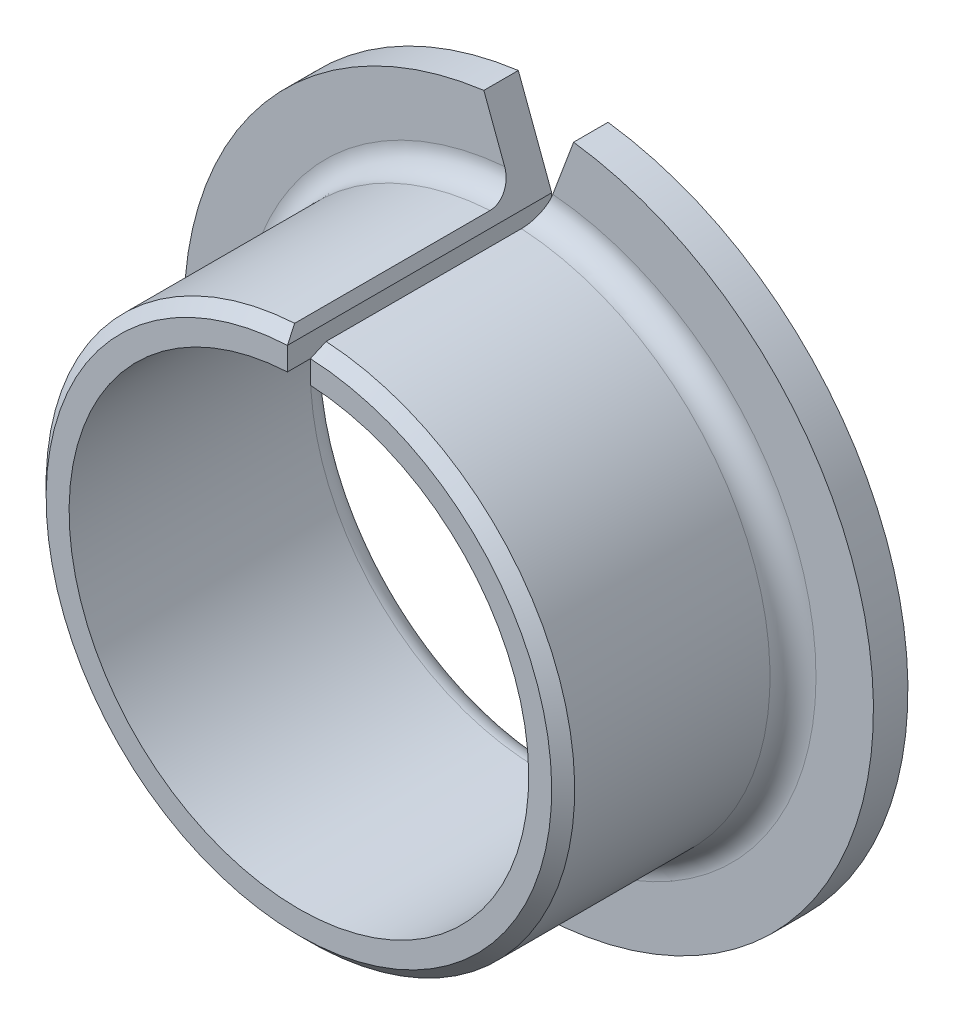
ISO-10303-21;
HEADER;
FILE_DESCRIPTION(('STEP AP214'),'2;1');
FILE_NAME('part.step','',(''),(''),'','','');
FILE_SCHEMA(('AUTOMOTIVE_DESIGN { 1 0 10303 214 1 1 1 1 }'));
ENDSEC;
DATA;
#1=APPLICATION_CONTEXT('core data for automotive mechanical design processes');
#2=APPLICATION_PROTOCOL_DEFINITION('international standard','automotive_design',2000,#1);
#3=PRODUCT_CONTEXT('',#1,'mechanical');
#4=PRODUCT('Part','Part','',(#3));
#5=PRODUCT_RELATED_PRODUCT_CATEGORY('part','',(#4));
#6=PRODUCT_DEFINITION_FORMATION('','',#4);
#7=PRODUCT_DEFINITION_CONTEXT('part definition',#1,'design');
#8=PRODUCT_DEFINITION('design','',#6,#7);
#9=PRODUCT_DEFINITION_SHAPE('','',#8);
#10=(LENGTH_UNIT() NAMED_UNIT(*) SI_UNIT(.MILLI.,.METRE.));
#11=(NAMED_UNIT(*) PLANE_ANGLE_UNIT() SI_UNIT($,.RADIAN.));
#12=(NAMED_UNIT(*) SI_UNIT($,.STERADIAN.) SOLID_ANGLE_UNIT());
#13=UNCERTAINTY_MEASURE_WITH_UNIT(LENGTH_MEASURE(1.E-05),#10,'distance_accuracy_value','');
#14=(GEOMETRIC_REPRESENTATION_CONTEXT(3) GLOBAL_UNCERTAINTY_ASSIGNED_CONTEXT((#13)) GLOBAL_UNIT_ASSIGNED_CONTEXT((#10,
#11,#12)) REPRESENTATION_CONTEXT('',''));
#15=CARTESIAN_POINT('',(0.,0.,0.));
#16=DIRECTION('',(0.,0.,1.));
#17=DIRECTION('',(1.,0.,0.));
#18=AXIS2_PLACEMENT_3D('',#15,#16,#17);
#19=CARTESIAN_POINT('',(0.,0.,11.5));
#20=DIRECTION('',(0.,0.,-1.));
#21=DIRECTION('',(-1.,0.,0.));
#22=AXIS2_PLACEMENT_3D('',#19,#20,#21);
#23=CYLINDRICAL_SURFACE('',#22,15.);
#24=CARTESIAN_POINT('',(0.,0.,1.5));
#25=DIRECTION('',(0.,0.,1.));
#26=DIRECTION('',(1.,0.,0.));
#27=AXIS2_PLACEMENT_3D('',#24,#25,#26);
#28=CIRCLE('',#27,15.);
#29=CARTESIAN_POINT('',(-1.95228920636886,14.8724095846872,1.5));
#30=VERTEX_POINT('',#29);
#31=CARTESIAN_POINT('',(1.95228920636886,14.8724095846872,1.5));
#32=VERTEX_POINT('',#31);
#33=EDGE_CURVE('E204',#30,#32,#28,.T.);
#34=ORIENTED_EDGE('',*,*,#33,.F.);
#35=DIRECTION('',(0.,0.,-1.));
#36=VECTOR('',#35,1.);
#37=CARTESIAN_POINT('',(-1.95228920636886,14.8724095846872,11.5));
#38=LINE('',#37,#36);
#39=CARTESIAN_POINT('',(-1.95228920636886,14.8724095846872,0.));
#40=VERTEX_POINT('',#39);
#41=EDGE_CURVE('E222',#30,#40,#38,.T.);
#42=ORIENTED_EDGE('',*,*,#41,.T.);
#43=CARTESIAN_POINT('',(0.,0.,0.));
#44=DIRECTION('',(0.,0.,1.));
#45=DIRECTION('',(1.,0.,0.));
#46=AXIS2_PLACEMENT_3D('',#43,#44,#45);
#47=CIRCLE('',#46,15.);
#48=CARTESIAN_POINT('',(1.95228920636886,14.8724095846872,0.));
#49=VERTEX_POINT('',#48);
#50=EDGE_CURVE('E141',#40,#49,#47,.T.);
#51=ORIENTED_EDGE('',*,*,#50,.T.);
#52=DIRECTION('',(0.,0.,-1.));
#53=VECTOR('',#52,1.);
#54=CARTESIAN_POINT('',(1.95228920636886,14.8724095846872,11.5));
#55=LINE('',#54,#53);
#56=EDGE_CURVE('E179',#49,#32,#55,.F.);
#57=ORIENTED_EDGE('',*,*,#56,.T.);
#58=EDGE_LOOP('',(#34,#42,#51,#57));
#59=FACE_BOUND('',#58,.T.);
#60=ADVANCED_FACE('F37',(#59),#23,.T.);
#61=CARTESIAN_POINT('',(0.,0.,0.));
#62=DIRECTION('',(0.,0.,1.));
#63=DIRECTION('',(1.,0.,0.));
#64=AXIS2_PLACEMENT_3D('',#61,#62,#63);
#65=PLANE('',#64);
#66=ORIENTED_EDGE('',*,*,#50,.F.);
#67=DIRECTION('',(0.350250483100219,-0.936656073000151,0.));
#68=VECTOR('',#67,1.);
#69=CARTESIAN_POINT('',(-2.,15.,0.));
#70=LINE('',#69,#68);
#71=CARTESIAN_POINT('',(-0.5,10.988630487918,0.));
#72=VERTEX_POINT('',#71);
#73=EDGE_CURVE('E129',#40,#72,#70,.T.);
#74=ORIENTED_EDGE('',*,*,#73,.T.);
#75=CARTESIAN_POINT('',(0.,0.,0.));
#76=DIRECTION('',(0.,0.,1.));
#77=DIRECTION('',(1.,0.,0.));
#78=AXIS2_PLACEMENT_3D('',#75,#76,#77);
#79=CIRCLE('',#78,11.);
#80=CARTESIAN_POINT('',(0.5,10.988630487918,0.));
#81=VERTEX_POINT('',#80);
#82=EDGE_CURVE('E124',#72,#81,#79,.T.);
#83=ORIENTED_EDGE('',*,*,#82,.T.);
#84=DIRECTION('',(0.350250483100219,0.936656073000151,0.));
#85=VECTOR('',#84,1.);
#86=CARTESIAN_POINT('',(2.,15.,0.));
#87=LINE('',#86,#85);
#88=EDGE_CURVE('E142',#81,#49,#87,.T.);
#89=ORIENTED_EDGE('',*,*,#88,.T.);
#90=EDGE_LOOP('',(#66,#74,#83,#89));
#91=FACE_BOUND('',#90,.T.);
#92=ADVANCED_FACE('F138',(#91),#65,.F.);
#93=CARTESIAN_POINT('',(0.,0.,1.5));
#94=DIRECTION('',(0.,0.,1.));
#95=DIRECTION('',(1.,0.,0.));
#96=AXIS2_PLACEMENT_3D('',#93,#94,#95);
#97=PLANE('',#96);
#98=DIRECTION('',(0.350250483100219,-0.936656073000151,0.));
#99=VECTOR('',#98,1.);
#100=CARTESIAN_POINT('',(3.16631443282972,1.18400252954494,1.5));
#101=LINE('',#100,#99);
#102=CARTESIAN_POINT('',(-1.04867897197192,12.4559332213104,1.5));
#103=VERTEX_POINT('',#102);
#104=EDGE_CURVE('E210',#30,#103,#101,.T.);
#105=ORIENTED_EDGE('',*,*,#104,.F.);
#106=ORIENTED_EDGE('',*,*,#33,.T.);
#107=DIRECTION('',(0.350250483100219,0.936656073000151,0.));
#108=VECTOR('',#107,1.);
#109=CARTESIAN_POINT('',(-3.16631443282972,1.18400252954494,1.5));
#110=LINE('',#109,#108);
#111=CARTESIAN_POINT('',(1.04867897197192,12.4559332213104,1.5));
#112=VERTEX_POINT('',#111);
#113=EDGE_CURVE('E198',#112,#32,#110,.T.);
#114=ORIENTED_EDGE('',*,*,#113,.F.);
#115=CARTESIAN_POINT('',(0.,0.,1.5));
#116=DIRECTION('',(0.,0.,1.));
#117=DIRECTION('',(1.,0.,0.));
#118=AXIS2_PLACEMENT_3D('',#115,#116,#117);
#119=CIRCLE('',#118,12.5);
#120=EDGE_CURVE('E148',#112,#103,#119,.F.);
#121=ORIENTED_EDGE('',*,*,#120,.T.);
#122=EDGE_LOOP('',(#105,#106,#114,#121));
#123=FACE_BOUND('',#122,.T.);
#124=ADVANCED_FACE('F207',(#123),#97,.T.);
#125=CARTESIAN_POINT('',(0.,0.,1.5));
#126=DIRECTION('',(0.,0.,1.));
#127=DIRECTION('',(1.,0.,0.));
#128=AXIS2_PLACEMENT_3D('',#125,#126,#127);
#129=CYLINDRICAL_SURFACE('',#128,11.5);
#130=DIRECTION('',(0.,0.,1.));
#131=VECTOR('',#130,1.);
#132=CARTESIAN_POINT('',(0.683615408171906,11.4796633214441,1.5));
#133=LINE('',#132,#131);
#134=CARTESIAN_POINT('',(0.683615408171906,11.4796633214441,11.));
#135=VERTEX_POINT('',#134);
#136=CARTESIAN_POINT('',(0.683615408171906,11.4796633214441,2.5));
#137=VERTEX_POINT('',#136);
#138=EDGE_CURVE('E197',#135,#137,#133,.F.);
#139=ORIENTED_EDGE('',*,*,#138,.F.);
#140=CARTESIAN_POINT('',(0.,0.,11.));
#141=DIRECTION('',(0.,0.,1.));
#142=DIRECTION('',(1.,0.,0.));
#143=AXIS2_PLACEMENT_3D('',#140,#141,#142);
#144=CIRCLE('',#143,11.5);
#145=CARTESIAN_POINT('',(-0.683615408171906,11.4796633214441,11.));
#146=VERTEX_POINT('',#145);
#147=EDGE_CURVE('E50',#135,#146,#144,.F.);
#148=ORIENTED_EDGE('',*,*,#147,.T.);
#149=DIRECTION('',(0.,0.,1.));
#150=VECTOR('',#149,1.);
#151=CARTESIAN_POINT('',(-0.683615408171906,11.4796633214441,1.5));
#152=LINE('',#151,#150);
#153=CARTESIAN_POINT('',(-0.683615408171906,11.4796633214441,2.5));
#154=VERTEX_POINT('',#153);
#155=EDGE_CURVE('E178',#154,#146,#152,.T.);
#156=ORIENTED_EDGE('',*,*,#155,.F.);
#157=CARTESIAN_POINT('',(0.,0.,2.5));
#158=DIRECTION('',(0.,0.,1.));
#159=DIRECTION('',(1.,0.,0.));
#160=AXIS2_PLACEMENT_3D('',#157,#158,#159);
#161=CIRCLE('',#160,11.5);
#162=EDGE_CURVE('E213',#154,#137,#161,.T.);
#163=ORIENTED_EDGE('',*,*,#162,.T.);
#164=EDGE_LOOP('',(#139,#148,#156,#163));
#165=FACE_BOUND('',#164,.T.);
#166=ADVANCED_FACE('F221',(#165),#129,.T.);
#167=CARTESIAN_POINT('',(0.,0.,11.5));
#168=DIRECTION('',(0.,0.,1.));
#169=DIRECTION('',(1.,0.,0.));
#170=AXIS2_PLACEMENT_3D('',#167,#168,#169);
#171=PLANE('',#170);
#172=DIRECTION('',(0.,-1.,0.));
#173=VECTOR('',#172,1.);
#174=CARTESIAN_POINT('',(-0.5,9.,11.5));
#175=LINE('',#174,#173);
#176=CARTESIAN_POINT('',(-0.5,10.988630487918,11.5));
#177=VERTEX_POINT('',#176);
#178=CARTESIAN_POINT('',(-0.5,9.98749217771909,11.5));
#179=VERTEX_POINT('',#178);
#180=EDGE_CURVE('E239',#177,#179,#175,.T.);
#181=ORIENTED_EDGE('',*,*,#180,.F.);
#182=CARTESIAN_POINT('',(0.,0.,11.5));
#183=DIRECTION('',(0.,0.,1.));
#184=DIRECTION('',(1.,0.,0.));
#185=AXIS2_PLACEMENT_3D('',#182,#183,#184);
#186=CIRCLE('',#185,11.);
#187=CARTESIAN_POINT('',(0.5,10.988630487918,11.5));
#188=VERTEX_POINT('',#187);
#189=EDGE_CURVE('E238',#177,#188,#186,.T.);
#190=ORIENTED_EDGE('',*,*,#189,.T.);
#191=DIRECTION('',(0.,1.,0.));
#192=VECTOR('',#191,1.);
#193=CARTESIAN_POINT('',(0.5,9.,11.5));
#194=LINE('',#193,#192);
#195=CARTESIAN_POINT('',(0.5,9.98749217771909,11.5));
#196=VERTEX_POINT('',#195);
#197=EDGE_CURVE('E233',#196,#188,#194,.T.);
#198=ORIENTED_EDGE('',*,*,#197,.F.);
#199=CARTESIAN_POINT('',(0.,0.,11.5));
#200=DIRECTION('',(0.,0.,1.));
#201=DIRECTION('',(1.,0.,0.));
#202=AXIS2_PLACEMENT_3D('',#199,#200,#201);
#203=CIRCLE('',#202,10.);
#204=EDGE_CURVE('E211',#179,#196,#203,.T.);
#205=ORIENTED_EDGE('',*,*,#204,.F.);
#206=EDGE_LOOP('',(#181,#190,#198,#205));
#207=FACE_BOUND('',#206,.T.);
#208=ADVANCED_FACE('F236',(#207),#171,.T.);
#209=CARTESIAN_POINT('',(0.,0.,-0.000999999999999265));
#210=DIRECTION('',(0.,0.,1.));
#211=DIRECTION('',(1.,0.,0.));
#212=AXIS2_PLACEMENT_3D('',#209,#210,#211);
#213=CYLINDRICAL_SURFACE('',#212,10.);
#214=ORIENTED_EDGE('',*,*,#204,.T.);
#215=DIRECTION('',(0.,0.,1.));
#216=VECTOR('',#215,1.);
#217=CARTESIAN_POINT('',(0.5,9.98749217771909,-0.000999999999999265));
#218=LINE('',#217,#216);
#219=CARTESIAN_POINT('',(0.5,9.98749217771909,1.));
#220=VERTEX_POINT('',#219);
#221=EDGE_CURVE('E216',#196,#220,#218,.F.);
#222=ORIENTED_EDGE('',*,*,#221,.T.);
#223=CARTESIAN_POINT('',(0.,0.,1.));
#224=DIRECTION('',(0.,0.,1.));
#225=DIRECTION('',(1.,0.,0.));
#226=AXIS2_PLACEMENT_3D('',#223,#224,#225);
#227=CIRCLE('',#226,10.);
#228=CARTESIAN_POINT('',(-0.5,9.98749217771909,1.));
#229=VERTEX_POINT('',#228);
#230=EDGE_CURVE('E146',#220,#229,#227,.F.);
#231=ORIENTED_EDGE('',*,*,#230,.T.);
#232=DIRECTION('',(0.,0.,1.));
#233=VECTOR('',#232,1.);
#234=CARTESIAN_POINT('',(-0.5,9.98749217771909,-0.000999999999999265));
#235=LINE('',#234,#233);
#236=EDGE_CURVE('E118',#229,#179,#235,.T.);
#237=ORIENTED_EDGE('',*,*,#236,.T.);
#238=EDGE_LOOP('',(#214,#222,#231,#237));
#239=FACE_BOUND('',#238,.T.);
#240=ADVANCED_FACE('F186',(#239),#213,.F.);
#241=CARTESIAN_POINT('',(0.,0.,2.5));
#242=DIRECTION('',(0.,0.,1.));
#243=DIRECTION('',(1.,0.,0.));
#244=AXIS2_PLACEMENT_3D('',#241,#242,#243);
#245=TOROIDAL_SURFACE('',#244,12.5,1.);
#246=ORIENTED_EDGE('',*,*,#162,.F.);
#247=CARTESIAN_POINT('',(-0.683615415500701,11.4796633410431,2.5002));
#248=CARTESIAN_POINT('',(-0.683613232459982,11.4796575030545,2.47294124013179));
#249=CARTESIAN_POINT('',(-0.684020115854289,11.4807456094831,2.44569565190877));
#250=CARTESIAN_POINT('',(-0.685645646292654,11.4850926783107,2.3914065100581));
#251=CARTESIAN_POINT('',(-0.686864176165539,11.4883513273651,2.36436292783813));
#252=CARTESIAN_POINT('',(-0.691718379211427,11.501332662101,2.28394391739117));
#253=CARTESIAN_POINT('',(-0.696552740616574,11.5142609354016,2.23111880725577));
#254=CARTESIAN_POINT('',(-0.709246409407984,11.5482069327258,2.12855775341461));
#255=CARTESIAN_POINT('',(-0.717105749504354,11.5692247442243,2.07882184312016));
#256=CARTESIAN_POINT('',(-0.735582917257868,11.6186372424883,1.98370890704678));
#257=CARTESIAN_POINT('',(-0.746201341250099,11.6470335240009,1.93833282648817));
#258=CARTESIAN_POINT('',(-0.770093988534386,11.7109283485869,1.85222405018933));
#259=CARTESIAN_POINT('',(-0.783416613870685,11.7465563306502,1.81160102527744));
#260=CARTESIAN_POINT('',(-0.81217706801384,11.8234688699192,1.73700506887641));
#261=CARTESIAN_POINT('',(-0.827615313579161,11.8647545416397,1.70303345086597));
#262=CARTESIAN_POINT('',(-0.860849205487845,11.9536301554866,1.64122735780453));
#263=CARTESIAN_POINT('',(-0.878715881830803,12.0014100493295,1.61370431005868));
#264=CARTESIAN_POINT('',(-0.91577577004326,12.1005173197939,1.56727435532421));
#265=CARTESIAN_POINT('',(-0.934969221807598,12.1518453379533,1.54836901122385));
#266=CARTESIAN_POINT('',(-0.97259841309571,12.2524750650849,1.52074299266876));
#267=CARTESIAN_POINT('',(-0.990972316586031,12.301611409271,1.51132973289506));
#268=CARTESIAN_POINT('',(-1.02799382679053,12.400616047488,1.50030368005686));
#269=CARTESIAN_POINT('',(-1.04664126570145,12.4504838927718,1.49868629004));
#270=CARTESIAN_POINT('',(-1.06523196411946,12.5002,1.50103593165955));
#271=B_SPLINE_CURVE_WITH_KNOTS('',3,(#247,#248,#249,#250,#251,#252,#253,#254,#255,#256,#257,
#258,#259,#260,#261,#262,#263,#264,#265,#266,#267,#268,#269,#270),.UNSPECIFIED.,.F.,.F.,(4,2,2,
2,2,2,2,2,2,2,2,4),(0.,0.0817248403297847,0.163437885227946,0.326386028139292,0.489335933112974,
0.652321086631187,0.818531892715533,0.9847754880511,1.15788528315104,1.33102646059396,
1.49034520608869,1.64956999537597),.UNSPECIFIED.);
#272=EDGE_CURVE('E171',#154,#103,#271,.T.);
#273=ORIENTED_EDGE('',*,*,#272,.T.);
#274=ORIENTED_EDGE('',*,*,#120,.F.);
#275=CARTESIAN_POINT('',(1.06523196411946,12.5002,1.50103593165955));
#276=CARTESIAN_POINT('',(1.04407025737969,12.4436083831736,1.49834680424833));
#277=CARTESIAN_POINT('',(1.02283275335782,12.3868140657429,1.50081906303479));
#278=CARTESIAN_POINT('',(0.980796418312366,12.2743985505423,1.51583036245102));
#279=CARTESIAN_POINT('',(0.959997626105736,12.2187774565784,1.5283702900594));
#280=CARTESIAN_POINT('',(0.919420025242193,12.1102629559268,1.56327241138687));
#281=CARTESIAN_POINT('',(0.899641873466128,12.0573713059002,1.58564084472967));
#282=CARTESIAN_POINT('',(0.861710635303063,11.9559338310183,1.63965488350746));
#283=CARTESIAN_POINT('',(0.843556994998553,11.9073865248511,1.67129731088958));
#284=CARTESIAN_POINT('',(0.809668629250529,11.8167606867338,1.7426076076532));
#285=CARTESIAN_POINT('',(0.79390489227966,11.7746045708129,1.78216290704402));
#286=CARTESIAN_POINT('',(0.76503610300436,11.6974023167131,1.86854191790905));
#287=CARTESIAN_POINT('',(0.75193100235155,11.6623560492388,1.9153654971793));
#288=CARTESIAN_POINT('',(0.729293660550267,11.601818220748,2.01307792448491));
#289=CARTESIAN_POINT('',(0.7196460492899,11.5760181316318,2.06374901443859));
#290=CARTESIAN_POINT('',(0.703621692878758,11.5331650551262,2.16912538223978));
#291=CARTESIAN_POINT('',(0.69724181618471,11.5161036932186,2.22382674005646));
#292=CARTESIAN_POINT('',(0.689629791483235,11.4957472640102,2.31579159964777));
#293=CARTESIAN_POINT('',(0.687375360027209,11.489718358937,2.35239024967237));
#294=CARTESIAN_POINT('',(0.684366125887887,11.4816709255495,2.42605277407775));
#295=CARTESIAN_POINT('',(0.683609974420198,11.4796487902535,2.46311619977626));
#296=CARTESIAN_POINT('',(0.6836154155007,11.4796633410431,2.5002));
#297=B_SPLINE_CURVE_WITH_KNOTS('',3,(#275,#276,#277,#278,#279,#280,#281,#282,#283,#284,#285,
#286,#287,#288,#289,#290,#291,#292,#293,#294,#295,#296),.UNSPECIFIED.,.F.,.F.,(4,2,2,2,2,2,2,2,
2,2,4),(0.,0.181206921446646,0.362429809280847,0.543767913010475,0.725043947517952,
0.903904219584881,1.08276123871372,1.25492375756022,1.42692097905342,1.53816963376759,
1.64931809442885),.UNSPECIFIED.);
#298=EDGE_CURVE('E132',#112,#137,#297,.T.);
#299=ORIENTED_EDGE('',*,*,#298,.T.);
#300=EDGE_LOOP('',(#246,#273,#274,#299));
#301=FACE_BOUND('',#300,.T.);
#302=ADVANCED_FACE('F182',(#301),#245,.F.);
#303=CARTESIAN_POINT('',(0.,0.,1.));
#304=DIRECTION('',(0.,0.,1.));
#305=DIRECTION('',(1.,0.,0.));
#306=AXIS2_PLACEMENT_3D('',#303,#304,#305);
#307=TOROIDAL_SURFACE('',#306,11.,1.);
#308=CARTESIAN_POINT('',(0.5,10.0071709036171,0.802713318248573));
#309=CARTESIAN_POINT('',(0.5,9.99609103352662,0.85771481816729));
#310=CARTESIAN_POINT('',(0.5,9.98964779987008,0.913691964762642));
#311=CARTESIAN_POINT('',(0.5,9.98624777296141,1.02597980608568));
#312=CARTESIAN_POINT('',(0.5,9.98930235663606,1.08229082012676));
#313=CARTESIAN_POINT('',(0.5,10.0048231762559,1.19357793142009));
#314=CARTESIAN_POINT('',(0.5,10.0172848478574,1.24855466272168));
#315=CARTESIAN_POINT('',(0.5,10.0512558743861,1.35562126949135));
#316=CARTESIAN_POINT('',(0.5,10.0727630065565,1.40771185062163));
#317=CARTESIAN_POINT('',(0.5,10.1242197096398,1.5075659911994));
#318=CARTESIAN_POINT('',(0.5,10.1541724027533,1.55532794177029));
#319=CARTESIAN_POINT('',(0.5,10.2216647992751,1.64515365729867));
#320=CARTESIAN_POINT('',(0.5,10.2592048332103,1.68721717388213));
#321=CARTESIAN_POINT('',(0.5,10.3408445517432,1.76449508000953));
#322=CARTESIAN_POINT('',(0.5,10.3849506892647,1.79970265232742));
#323=CARTESIAN_POINT('',(0.5,10.4784421137566,1.86222324391373));
#324=CARTESIAN_POINT('',(0.5,10.527827424275,1.88953622796571));
#325=CARTESIAN_POINT('',(0.5,10.6305358137158,1.9355241904416));
#326=CARTESIAN_POINT('',(0.5,10.6838633007811,1.95418932409669));
#327=CARTESIAN_POINT('',(0.5,10.7928937125425,1.98230890473171));
#328=CARTESIAN_POINT('',(0.5,10.8485966438889,1.99176332592364));
#329=CARTESIAN_POINT('',(0.5,10.960839059132,2.00119761675228));
#330=CARTESIAN_POINT('',(0.5,11.01737910742,2.00117077324358));
#331=CARTESIAN_POINT('',(0.5,11.1296524213029,1.9916255167702));
#332=CARTESIAN_POINT('',(0.5,11.1853856851963,1.98210708379043));
#333=CARTESIAN_POINT('',(0.5,11.2944635913387,1.95384623328171));
#334=CARTESIAN_POINT('',(0.5,11.3478081915646,1.93510365354458));
#335=CARTESIAN_POINT('',(0.5,11.4505908795815,1.88892355743027));
#336=CARTESIAN_POINT('',(0.5,11.5000289785114,1.86148606584644));
#337=CARTESIAN_POINT('',(0.5,11.5935633550761,1.79871117046361));
#338=CARTESIAN_POINT('',(0.5,11.6376627628545,1.76337843067557));
#339=CARTESIAN_POINT('',(0.5,11.7192971574249,1.68580476664393));
#340=CARTESIAN_POINT('',(0.5,11.7568321732095,1.64356387291287));
#341=CARTESIAN_POINT('',(0.5,11.8242366401113,1.55341320255538));
#342=CARTESIAN_POINT('',(0.5,11.8541128826405,1.50550850377986));
#343=CARTESIAN_POINT('',(0.5,11.9053910384518,1.40536004324511));
#344=CARTESIAN_POINT('',(0.5,11.9267929923276,1.35311630227234));
#345=CARTESIAN_POINT('',(0.5,11.9604973394085,1.2458193402309));
#346=CARTESIAN_POINT('',(0.5,11.972807249214,1.19076848021863));
#347=CARTESIAN_POINT('',(0.5,11.9880052131166,1.07938125997021));
#348=CARTESIAN_POINT('',(0.5,11.990893297531,1.02304490387108));
#349=CARTESIAN_POINT('',(0.5,11.9871661040736,0.91071431209137));
#350=CARTESIAN_POINT('',(0.5,11.9805553299646,0.854719926908676));
#351=CARTESIAN_POINT('',(0.5,11.9580271661705,0.744635818474517));
#352=CARTESIAN_POINT('',(0.5,11.9421097844555,0.690546093591969));
#353=CARTESIAN_POINT('',(0.5,11.9014215247429,0.585804098259012));
#354=CARTESIAN_POINT('',(0.5,11.876650361209,0.535151938733543));
#355=CARTESIAN_POINT('',(0.5,11.8189601315268,0.438722320580715));
#356=CARTESIAN_POINT('',(0.5,11.7860410452457,0.392944873998744));
#357=CARTESIAN_POINT('',(0.5,11.7129718825726,0.307537403422089));
#358=CARTESIAN_POINT('',(0.5,11.6728179929408,0.26791064186357));
#359=CARTESIAN_POINT('',(0.5,11.5864323827017,0.195953936333507));
#360=CARTESIAN_POINT('',(0.5,11.540200642647,0.163624015710548));
#361=CARTESIAN_POINT('',(0.5,11.4429297231757,0.107149017514491));
#362=CARTESIAN_POINT('',(0.5,11.3918864807537,0.083010937988435));
#363=CARTESIAN_POINT('',(0.5,11.2864743605222,0.0436382606170937));
#364=CARTESIAN_POINT('',(0.5,11.2321054598757,0.0284037239191655));
#365=CARTESIAN_POINT('',(0.5,11.1215347089745,0.00725758942622243));
#366=CARTESIAN_POINT('',(0.5,11.0653313031353,0.00135412525306372));
#367=CARTESIAN_POINT('',(0.5,10.9527305766744,-0.000938761962910098));
#368=CARTESIAN_POINT('',(0.5,10.8963332549266,0.00267187033221082));
#369=CARTESIAN_POINT('',(0.5,10.7849131800797,0.0193091960542635));
#370=CARTESIAN_POINT('',(0.5,10.7298911992942,0.0323410622482765));
#371=CARTESIAN_POINT('',(0.5,10.6228183861106,0.0674576323577909));
#372=CARTESIAN_POINT('',(0.5,10.570767439418,0.0895419877599696));
#373=CARTESIAN_POINT('',(0.5,10.471124260821,0.14213333158635));
#374=CARTESIAN_POINT('',(0.5,10.4235311132496,0.172638585188096));
#375=CARTESIAN_POINT('',(0.5,10.3341344669973,0.241221320664098));
#376=CARTESIAN_POINT('',(0.5,10.2923323911185,0.279300657829114));
#377=CARTESIAN_POINT('',(0.5,10.215738889292,0.361927778752371));
#378=CARTESIAN_POINT('',(0.5,10.1809453482409,0.406473603987305));
#379=CARTESIAN_POINT('',(0.5,10.1193774115686,0.500746791629714));
#380=CARTESIAN_POINT('',(0.5,10.0925933547641,0.550467813185913));
#381=CARTESIAN_POINT('',(0.5,10.0561929360654,0.634268519113381));
#382=CARTESIAN_POINT('',(0.5,10.0439060325543,0.667215500983405));
#383=CARTESIAN_POINT('',(0.5,10.0228637896669,0.734218594070816));
#384=CARTESIAN_POINT('',(0.5,10.0141084483224,0.76827470467005));
#385=CARTESIAN_POINT('',(0.5,10.0071709036171,0.802713318248573));
#386=B_SPLINE_CURVE_WITH_KNOTS('',3,(#308,#309,#310,#311,#312,#313,#314,#315,#316,#317,#318,
#319,#320,#321,#322,#323,#324,#325,#326,#327,#328,#329,#330,#331,#332,#333,#334,#335,#336,#337,
#338,#339,#340,#341,#342,#343,#344,#345,#346,#347,#348,#349,#350,#351,#352,#353,#354,#355,#356,
#357,#358,#359,#360,#361,#362,#363,#364,#365,#366,#367,#368,#369,#370,#371,#372,#373,#374,#375,
#376,#377,#378,#379,#380,#381,#382,#383,#384,#385),.UNSPECIFIED.,.T.,.F.,(4,2,2,2,2,2,2,2,2,2,2,
2,2,2,2,2,2,2,2,2,2,2,2,2,2,2,2,2,2,2,2,2,2,2,2,2,2,2,4),(0.,0.168190980140679,0.33658350482972,
0.504894377498017,0.673163914984053,0.841495741006733,1.00983490164292,1.17834060546786,
1.34684706095678,1.51554487677617,1.68424316491158,1.85306089896929,2.02187898901697,
2.19070004786541,2.35952062532868,2.5282417367389,2.69696210294703,2.8655323348726,
3.03410175929845,3.2025316670648,3.37096103286043,3.53931056636534,3.7076599556982,
3.87601477482616,4.04437000994831,4.21281424084175,4.38125901071893,4.54984731787029,
4.71843678283135,4.88717312139492,5.05591044140127,5.22474047775533,5.39356401490347,
5.56235279797173,5.73118297730636,5.89996212884846,6.06853686706443,6.17384794783816,
6.2791589699197),.UNSPECIFIED.);
#387=EDGE_CURVE('E123',#81,#220,#386,.T.);
#388=ORIENTED_EDGE('',*,*,#387,.F.);
#389=ORIENTED_EDGE('',*,*,#82,.F.);
#390=CARTESIAN_POINT('',(-0.5,10.0071709036171,0.802713318248573));
#391=CARTESIAN_POINT('',(-0.5,10.0182636697298,0.747673135076197));
#392=CARTESIAN_POINT('',(-0.5,10.0340158866889,0.693530112498307));
#393=CARTESIAN_POINT('',(-0.5,10.0744037539065,0.588613896447148));
#394=CARTESIAN_POINT('',(-0.5,10.0990501383898,0.537844863036142));
#395=CARTESIAN_POINT('',(-0.5,10.1565057462783,0.441187218500134));
#396=CARTESIAN_POINT('',(-0.5,10.1893107134497,0.395296080398683));
#397=CARTESIAN_POINT('',(-0.5,10.2621450512378,0.309680138315429));
#398=CARTESIAN_POINT('',(-0.5,10.3021726400127,0.269953817941181));
#399=CARTESIAN_POINT('',(-0.5,10.3883592854232,0.197740264226625));
#400=CARTESIAN_POINT('',(-0.5,10.4345238061161,0.165259551892886));
#401=CARTESIAN_POINT('',(-0.5,10.5316476705099,0.108498328449711));
#402=CARTESIAN_POINT('',(-0.5,10.5826072309408,0.08421818822391));
#403=CARTESIAN_POINT('',(-0.5,10.6879320551432,0.0445227163277587));
#404=CARTESIAN_POINT('',(-0.5,10.7423009171636,0.0291169315860037));
#405=CARTESIAN_POINT('',(-0.5,10.8528526685034,0.00764570777209138));
#406=CARTESIAN_POINT('',(-0.5,10.9090355617184,0.00158028876057218));
#407=CARTESIAN_POINT('',(-0.5,11.0216562446914,-0.00103916650755097));
#408=CARTESIAN_POINT('',(-0.5,11.0780941661066,0.00241245278836868));
#409=CARTESIAN_POINT('',(-0.5,11.1895892775696,0.0187427354821666));
#410=CARTESIAN_POINT('',(-0.5,11.2446464696408,0.0316213850641758));
#411=CARTESIAN_POINT('',(-0.5,11.351810292524,0.0664409002719112));
#412=CARTESIAN_POINT('',(-0.5,11.4039172343515,0.0883808086294712));
#413=CARTESIAN_POINT('',(-0.5,11.5037047099243,0.140702945558222));
#414=CARTESIAN_POINT('',(-0.5,11.5513852520288,0.171085158185827));
#415=CARTESIAN_POINT('',(-0.5,11.6409315120479,0.239408545753292));
#416=CARTESIAN_POINT('',(-0.5,11.682801104415,0.277344642649933));
#417=CARTESIAN_POINT('',(-0.5,11.7595699409462,0.359713375078768));
#418=CARTESIAN_POINT('',(-0.5,11.7944692208755,0.404145977274828));
#419=CARTESIAN_POINT('',(-0.5,11.8562733107612,0.498203315717882));
#420=CARTESIAN_POINT('',(-0.5,11.8831853229313,0.5478233194831));
#421=CARTESIAN_POINT('',(-0.5,11.9282893605941,0.650879767607874));
#422=CARTESIAN_POINT('',(-0.5,11.946481424954,0.704316194955377));
#423=CARTESIAN_POINT('',(-0.5,11.9736153492833,0.813443624681704));
#424=CARTESIAN_POINT('',(-0.5,11.9825644336309,0.86913283083787));
#425=CARTESIAN_POINT('',(-0.5,11.9909821180109,0.981223143463273));
#426=CARTESIAN_POINT('',(-0.5,11.9904507456114,1.03762424786191));
#427=CARTESIAN_POINT('',(-0.5,11.979924806088,1.1495140740228));
#428=CARTESIAN_POINT('',(-0.5,11.969933926861,1.20500314277602));
#429=CARTESIAN_POINT('',(-0.5,11.9407792632876,1.31351665941163));
#430=CARTESIAN_POINT('',(-0.5,11.921615480529,1.36654110772065));
#431=CARTESIAN_POINT('',(-0.5,11.8746581227584,1.46862823885225));
#432=CARTESIAN_POINT('',(-0.5,11.846863450846,1.51769041711038));
#433=CARTESIAN_POINT('',(-0.5,11.7834364753953,1.61045574815065));
#434=CARTESIAN_POINT('',(-0.5,11.7478041530708,1.65415888808728));
#435=CARTESIAN_POINT('',(-0.5,11.6696912475822,1.73499460155809));
#436=CARTESIAN_POINT('',(-0.5,11.6272065447131,1.77212319407449));
#437=CARTESIAN_POINT('',(-0.5,11.5366114620112,1.83872832398034));
#438=CARTESIAN_POINT('',(-0.5,11.4885010544292,1.86820482362304));
#439=CARTESIAN_POINT('',(-0.5,11.3879749777368,1.91869679129136));
#440=CARTESIAN_POINT('',(-0.5,11.3355555492035,1.93970477454653));
#441=CARTESIAN_POINT('',(-0.5,11.2279356337483,1.9726303912701));
#442=CARTESIAN_POINT('',(-0.5,11.1727351358984,1.98454798901575));
#443=CARTESIAN_POINT('',(-0.5,11.0610704696678,1.9989638639918));
#444=CARTESIAN_POINT('',(-0.5,11.0046052811838,2.00145424017399));
#445=CARTESIAN_POINT('',(-0.5,10.892057493169,1.99692445287966));
#446=CARTESIAN_POINT('',(-0.5,10.835974895644,1.98990423958482));
#447=CARTESIAN_POINT('',(-0.5,10.725759131742,1.96654687329227));
#448=CARTESIAN_POINT('',(-0.5,10.6716268179634,1.9502056967899));
#449=CARTESIAN_POINT('',(-0.5,10.5668746671519,1.90866524226473));
#450=CARTESIAN_POINT('',(-0.5,10.5162548368746,1.88346594720509));
#451=CARTESIAN_POINT('',(-0.5,10.4199776796097,1.82492802767097));
#452=CARTESIAN_POINT('',(-0.5,10.3743193097871,1.79159111841863));
#453=CARTESIAN_POINT('',(-0.5,10.2892554181715,1.71772007070332));
#454=CARTESIAN_POINT('',(-0.5,10.2498496253022,1.67718624441939));
#455=CARTESIAN_POINT('',(-0.5,10.1784491991295,1.59011343565691));
#456=CARTESIAN_POINT('',(-0.5,10.1464473044002,1.54358040730729));
#457=CARTESIAN_POINT('',(-0.5,10.0907127921646,1.44578389751698));
#458=CARTESIAN_POINT('',(-0.5,10.066982181766,1.39451927171983));
#459=CARTESIAN_POINT('',(-0.5,10.0284938960686,1.28877091896225));
#460=CARTESIAN_POINT('',(-0.5,10.0137300920584,1.2342894187073));
#461=CARTESIAN_POINT('',(-0.5,9.99358818885414,1.12366495243578));
#462=CARTESIAN_POINT('',(-0.5,9.9881987374711,1.06752407983943));
#463=CARTESIAN_POINT('',(-0.5,9.98715682896396,0.976368072951436));
#464=CARTESIAN_POINT('',(-0.5,9.9886013577326,0.941360929488149));
#465=CARTESIAN_POINT('',(-0.5,9.99515054940125,0.871690727573725));
#466=CARTESIAN_POINT('',(-0.5,10.0002552095951,0.837027668868203));
#467=CARTESIAN_POINT('',(-0.5,10.0071709036171,0.802713318248573));
#468=B_SPLINE_CURVE_WITH_KNOTS('',3,(#390,#391,#392,#393,#394,#395,#396,#397,#398,#399,#400,
#401,#402,#403,#404,#405,#406,#407,#408,#409,#410,#411,#412,#413,#414,#415,#416,#417,#418,#419,
#420,#421,#422,#423,#424,#425,#426,#427,#428,#429,#430,#431,#432,#433,#434,#435,#436,#437,#438,
#439,#440,#441,#442,#443,#444,#445,#446,#447,#448,#449,#450,#451,#452,#453,#454,#455,#456,#457,
#458,#459,#460,#461,#462,#463,#464,#465,#466,#467),.UNSPECIFIED.,.T.,.F.,(4,2,2,2,2,2,2,2,2,2,2,
2,2,2,2,2,2,2,2,2,2,2,2,2,2,2,2,2,2,2,2,2,2,2,2,2,2,2,4),(0.,0.168312696293296,
0.336829209518509,0.505257993456977,0.673645282193145,0.842183512547355,1.01072936428495,
1.17945619868762,1.34818339547046,1.51701088092728,1.68583811895795,1.85464752595415,
2.02345661415005,2.19215260248045,2.3608477251955,2.52939026812124,2.69793205980025,
2.86634201811189,3.03475148670555,3.2030953259632,3.37143913608146,3.53980434979016,
3.70816996705876,3.87663718697157,4.04510523789468,4.21372186200682,4.38233914873344,
4.55109772403773,4.71985718333574,4.88868954485064,5.05752223108301,5.22631936194461,
5.39510917271918,5.56373273320992,5.73239718341041,5.90094622324236,6.06929101044745,
6.17422425760783,6.27915742718423),.UNSPECIFIED.);
#469=EDGE_CURVE('E112',#229,#72,#468,.T.);
#470=ORIENTED_EDGE('',*,*,#469,.F.);
#471=ORIENTED_EDGE('',*,*,#230,.F.);
#472=EDGE_LOOP('',(#388,#389,#470,#471));
#473=FACE_BOUND('',#472,.T.);
#474=ADVANCED_FACE('F145',(#473),#307,.T.);
#475=CARTESIAN_POINT('',(-0.5,9.,0.));
#476=DIRECTION('',(-1.,0.,0.));
#477=DIRECTION('',(0.,0.,1.));
#478=AXIS2_PLACEMENT_3D('',#475,#476,#477);
#479=PLANE('',#478);
#480=ORIENTED_EDGE('',*,*,#469,.T.);
#481=DIRECTION('',(0.,0.,1.));
#482=VECTOR('',#481,1.);
#483=CARTESIAN_POINT('',(-0.5,10.988630487918,0.));
#484=LINE('',#483,#482);
#485=EDGE_CURVE('E115',#72,#177,#484,.T.);
#486=ORIENTED_EDGE('',*,*,#485,.T.);
#487=ORIENTED_EDGE('',*,*,#180,.T.);
#488=ORIENTED_EDGE('',*,*,#236,.F.);
#489=EDGE_LOOP('',(#480,#486,#487,#488));
#490=FACE_BOUND('',#489,.T.);
#491=ADVANCED_FACE('F114',(#490),#479,.F.);
#492=CARTESIAN_POINT('',(-2.,15.,0.));
#493=DIRECTION('',(-0.93665607300015,-0.350250483100219,0.));
#494=DIRECTION('',(0.350250483100219,-0.936656073000151,0.));
#495=AXIS2_PLACEMENT_3D('',#492,#493,#494);
#496=PLANE('',#495);
#497=ORIENTED_EDGE('',*,*,#155,.T.);
#498=CARTESIAN_POINT('',(-0.683615408171906,11.4796633214441,11.));
#499=CARTESIAN_POINT('',(-0.653045011607729,11.3979105502776,11.0834296379569));
#500=CARTESIAN_POINT('',(-0.622458529414702,11.316114762177,11.1668111233211));
#501=CARTESIAN_POINT('',(-0.561253393357834,11.1524371510027,11.3334777899891));
#502=CARTESIAN_POINT('',(-0.530634739493559,11.070555327928,11.4167629712915));
#503=CARTESIAN_POINT('',(-0.5,10.988630487918,11.5));
#504=B_SPLINE_CURVE_WITH_KNOTS('',3,(#498,#499,#500,#501,#502,#503),.UNSPECIFIED.,.F.,.F.,(4,2,
4),(0.,0.362225072999395,0.72445015088855),.UNSPECIFIED.);
#505=EDGE_CURVE('E12',#146,#177,#504,.T.);
#506=ORIENTED_EDGE('',*,*,#505,.T.);
#507=ORIENTED_EDGE('',*,*,#485,.F.);
#508=ORIENTED_EDGE('',*,*,#73,.F.);
#509=ORIENTED_EDGE('',*,*,#41,.F.);
#510=ORIENTED_EDGE('',*,*,#104,.T.);
#511=ORIENTED_EDGE('',*,*,#272,.F.);
#512=EDGE_LOOP('',(#497,#506,#507,#508,#509,#510,#511));
#513=FACE_BOUND('',#512,.T.);
#514=ADVANCED_FACE('F128',(#513),#496,.F.);
#515=CARTESIAN_POINT('',(0.5,9.,0.));
#516=DIRECTION('',(1.,0.,0.));
#517=DIRECTION('',(0.,0.,-1.));
#518=AXIS2_PLACEMENT_3D('',#515,#516,#517);
#519=PLANE('',#518);
#520=ORIENTED_EDGE('',*,*,#197,.T.);
#521=DIRECTION('',(0.,0.,1.));
#522=VECTOR('',#521,1.);
#523=CARTESIAN_POINT('',(0.5,10.988630487918,0.));
#524=LINE('',#523,#522);
#525=EDGE_CURVE('E133',#81,#188,#524,.T.);
#526=ORIENTED_EDGE('',*,*,#525,.F.);
#527=ORIENTED_EDGE('',*,*,#387,.T.);
#528=ORIENTED_EDGE('',*,*,#221,.F.);
#529=EDGE_LOOP('',(#520,#526,#527,#528));
#530=FACE_BOUND('',#529,.T.);
#531=ADVANCED_FACE('F166',(#530),#519,.F.);
#532=CARTESIAN_POINT('',(2.,15.,0.));
#533=DIRECTION('',(0.93665607300015,-0.350250483100219,0.));
#534=DIRECTION('',(0.350250483100219,0.936656073000151,0.));
#535=AXIS2_PLACEMENT_3D('',#532,#533,#534);
#536=PLANE('',#535);
#537=ORIENTED_EDGE('',*,*,#525,.T.);
#538=CARTESIAN_POINT('',(0.499999999999999,10.988630487918,11.5));
#539=CARTESIAN_POINT('',(0.530634739493559,11.070555327928,11.4167629712915));
#540=CARTESIAN_POINT('',(0.561253393357834,11.1524371510027,11.3334777899891));
#541=CARTESIAN_POINT('',(0.622458529414701,11.316114762177,11.1668111233211));
#542=CARTESIAN_POINT('',(0.653045011607729,11.3979105502776,11.0834296379569));
#543=CARTESIAN_POINT('',(0.683615408171905,11.4796633214441,11.));
#544=B_SPLINE_CURVE_WITH_KNOTS('',3,(#538,#539,#540,#541,#542,#543),.UNSPECIFIED.,.F.,.F.,(4,2,
4),(0.,0.362225077889155,0.72445015088855),.UNSPECIFIED.);
#545=EDGE_CURVE('E64',#188,#135,#544,.T.);
#546=ORIENTED_EDGE('',*,*,#545,.T.);
#547=ORIENTED_EDGE('',*,*,#138,.T.);
#548=ORIENTED_EDGE('',*,*,#298,.F.);
#549=ORIENTED_EDGE('',*,*,#113,.T.);
#550=ORIENTED_EDGE('',*,*,#56,.F.);
#551=ORIENTED_EDGE('',*,*,#88,.F.);
#552=EDGE_LOOP('',(#537,#546,#547,#548,#549,#550,#551));
#553=FACE_BOUND('',#552,.T.);
#554=ADVANCED_FACE('F167',(#553),#536,.F.);
#555=CARTESIAN_POINT('',(0.,0.,11.5));
#556=DIRECTION('',(0.,0.,-1.));
#557=DIRECTION('',(-1.,0.,0.));
#558=AXIS2_PLACEMENT_3D('',#555,#556,#557);
#559=CONICAL_SURFACE('',#558,11.,0.785398163397453);
#560=ORIENTED_EDGE('',*,*,#505,.F.);
#561=ORIENTED_EDGE('',*,*,#147,.F.);
#562=ORIENTED_EDGE('',*,*,#545,.F.);
#563=ORIENTED_EDGE('',*,*,#189,.F.);
#564=EDGE_LOOP('',(#560,#561,#562,#563));
#565=FACE_BOUND('',#564,.T.);
#566=ADVANCED_FACE('F39',(#565),#559,.T.);
#567=CLOSED_SHELL('',(#60,#92,#124,#166,#208,#240,#302,#474,#491,#514,#531,#554,#566));
#568=MANIFOLD_SOLID_BREP('B2',#567);
#569=ADVANCED_BREP_SHAPE_REPRESENTATION('',(#18,#568),#14);
#570=SHAPE_DEFINITION_REPRESENTATION(#9,#569);
ENDSEC;
END-ISO-10303-21;
